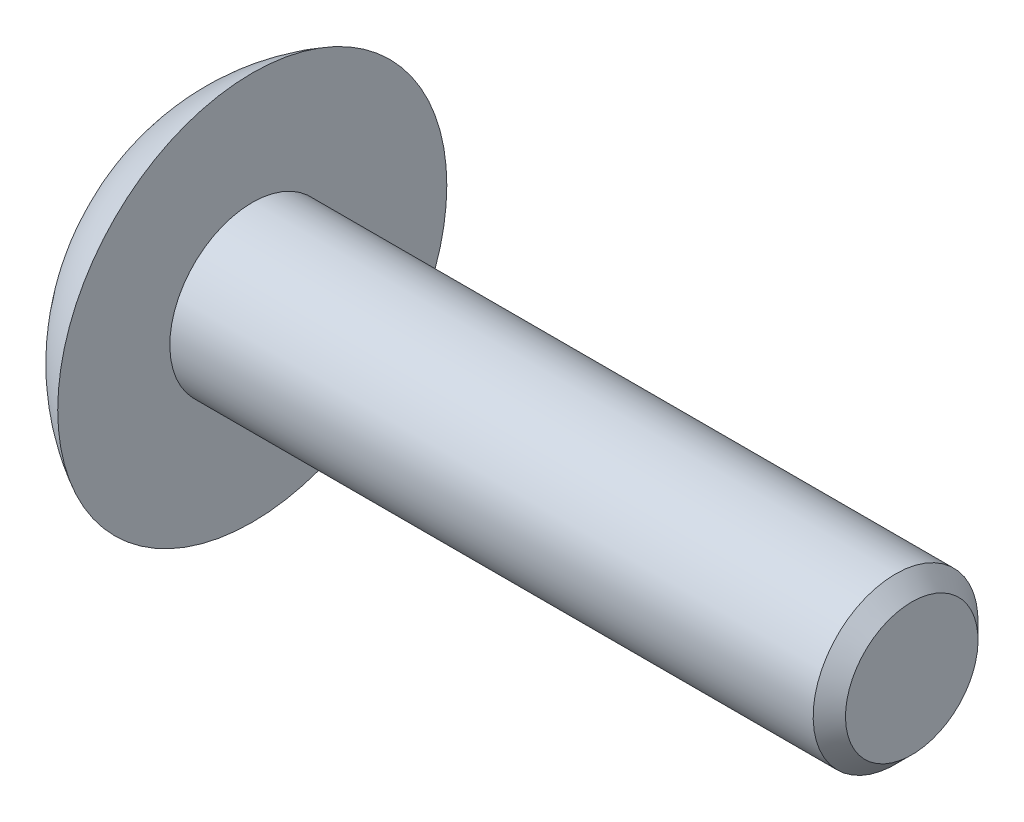
ISO-10303-21;
HEADER;
FILE_DESCRIPTION(('STEP AP214'),'2;1');
FILE_NAME('part.step','',(''),(''),'','','');
FILE_SCHEMA(('AUTOMOTIVE_DESIGN { 1 0 10303 214 1 1 1 1 }'));
ENDSEC;
DATA;
#1=APPLICATION_CONTEXT('core data for automotive mechanical design processes');
#2=APPLICATION_PROTOCOL_DEFINITION('international standard','automotive_design',2000,#1);
#3=PRODUCT_CONTEXT('',#1,'mechanical');
#4=PRODUCT('Part','Part','',(#3));
#5=PRODUCT_RELATED_PRODUCT_CATEGORY('part','',(#4));
#6=PRODUCT_DEFINITION_FORMATION('','',#4);
#7=PRODUCT_DEFINITION_CONTEXT('part definition',#1,'design');
#8=PRODUCT_DEFINITION('design','',#6,#7);
#9=PRODUCT_DEFINITION_SHAPE('','',#8);
#10=(LENGTH_UNIT() NAMED_UNIT(*) SI_UNIT(.MILLI.,.METRE.));
#11=(NAMED_UNIT(*) PLANE_ANGLE_UNIT() SI_UNIT($,.RADIAN.));
#12=(NAMED_UNIT(*) SI_UNIT($,.STERADIAN.) SOLID_ANGLE_UNIT());
#13=UNCERTAINTY_MEASURE_WITH_UNIT(LENGTH_MEASURE(1.E-05),#10,'distance_accuracy_value','');
#14=(GEOMETRIC_REPRESENTATION_CONTEXT(3) GLOBAL_UNCERTAINTY_ASSIGNED_CONTEXT((#13)) GLOBAL_UNIT_ASSIGNED_CONTEXT((#10,
#11,#12)) REPRESENTATION_CONTEXT('',''));
#15=CARTESIAN_POINT('',(0.,0.,0.));
#16=DIRECTION('',(0.,0.,1.));
#17=DIRECTION('',(1.,0.,0.));
#18=AXIS2_PLACEMENT_3D('',#15,#16,#17);
#19=CARTESIAN_POINT('',(0.,4.2,0.));
#20=DIRECTION('',(1.,0.,0.));
#21=DIRECTION('',(0.,1.,0.));
#22=AXIS2_PLACEMENT_3D('',#19,#20,#21);
#23=PLANE('',#22);
#24=CARTESIAN_POINT('',(0.,0.,0.));
#25=DIRECTION('',(-1.,0.,0.));
#26=DIRECTION('',(0.,0.,1.));
#27=AXIS2_PLACEMENT_3D('',#24,#25,#26);
#28=CIRCLE('',#27,5.90000000000001);
#29=CARTESIAN_POINT('',(0.,0.,5.90000000000001));
#30=VERTEX_POINT('',#29);
#31=EDGE_CURVE('E241',#30,#30,#28,.F.);
#32=ORIENTED_EDGE('',*,*,#31,.T.);
#33=EDGE_LOOP('',(#32));
#34=FACE_BOUND('',#33,.T.);
#35=CARTESIAN_POINT('',(0.,0.,0.));
#36=DIRECTION('',(1.,0.,0.));
#37=DIRECTION('',(0.,1.,0.));
#38=AXIS2_PLACEMENT_3D('',#35,#36,#37);
#39=CIRCLE('',#38,2.5);
#40=CARTESIAN_POINT('',(0.,2.5,0.));
#41=VERTEX_POINT('',#40);
#42=EDGE_CURVE('E198',#41,#41,#39,.T.);
#43=ORIENTED_EDGE('',*,*,#42,.F.);
#44=EDGE_LOOP('',(#43));
#45=FACE_BOUND('',#44,.T.);
#46=ADVANCED_FACE('F42',(#34,#45),#23,.T.);
#47=CARTESIAN_POINT('',(-1.55,0.,0.));
#48=DIRECTION('',(1.,0.,0.));
#49=DIRECTION('',(0.,0.,-1.));
#50=AXIS2_PLACEMENT_3D('',#47,#48,#49);
#51=PLANE('',#50);
#52=DIRECTION('',(0.,0.,1.));
#53=VECTOR('',#52,1.);
#54=CARTESIAN_POINT('',(-1.55,0.786666666666667,0.786666666666667));
#55=LINE('',#54,#53);
#56=CARTESIAN_POINT('',(-1.55,0.786666666666667,2.95));
#57=VERTEX_POINT('',#56);
#58=CARTESIAN_POINT('',(-1.55,0.786666666666667,0.786666666666667));
#59=VERTEX_POINT('',#58);
#60=EDGE_CURVE('E219',#57,#59,#55,.F.);
#61=ORIENTED_EDGE('',*,*,#60,.T.);
#62=DIRECTION('',(0.,-1.,0.));
#63=VECTOR('',#62,1.);
#64=CARTESIAN_POINT('',(-1.55,2.95,0.786666666666667));
#65=LINE('',#64,#63);
#66=CARTESIAN_POINT('',(-1.55,2.95,0.786666666666667));
#67=VERTEX_POINT('',#66);
#68=EDGE_CURVE('E226',#59,#67,#65,.F.);
#69=ORIENTED_EDGE('',*,*,#68,.T.);
#70=DIRECTION('',(0.,0.,1.));
#71=VECTOR('',#70,1.);
#72=CARTESIAN_POINT('',(-1.55,2.95,-0.786666666666667));
#73=LINE('',#72,#71);
#74=CARTESIAN_POINT('',(-1.55,2.95,-0.786666666666667));
#75=VERTEX_POINT('',#74);
#76=EDGE_CURVE('E231',#67,#75,#73,.F.);
#77=ORIENTED_EDGE('',*,*,#76,.T.);
#78=DIRECTION('',(0.,1.,0.));
#79=VECTOR('',#78,1.);
#80=CARTESIAN_POINT('',(-1.55,0.786666666666667,-0.786666666666667));
#81=LINE('',#80,#79);
#82=CARTESIAN_POINT('',(-1.55,0.786666666666667,-0.786666666666667));
#83=VERTEX_POINT('',#82);
#84=EDGE_CURVE('E235',#75,#83,#81,.F.);
#85=ORIENTED_EDGE('',*,*,#84,.T.);
#86=DIRECTION('',(0.,0.,1.));
#87=VECTOR('',#86,1.);
#88=CARTESIAN_POINT('',(-1.55,0.786666666666667,-2.95));
#89=LINE('',#88,#87);
#90=CARTESIAN_POINT('',(-1.55,0.786666666666667,-2.95));
#91=VERTEX_POINT('',#90);
#92=EDGE_CURVE('E194',#83,#91,#89,.F.);
#93=ORIENTED_EDGE('',*,*,#92,.T.);
#94=DIRECTION('',(0.,1.,0.));
#95=VECTOR('',#94,1.);
#96=CARTESIAN_POINT('',(-1.55,0.,-2.95));
#97=LINE('',#96,#95);
#98=CARTESIAN_POINT('',(-1.55,-0.786666666666667,-2.95));
#99=VERTEX_POINT('',#98);
#100=EDGE_CURVE('E122',#99,#91,#97,.T.);
#101=ORIENTED_EDGE('',*,*,#100,.F.);
#102=DIRECTION('',(0.,0.,-1.));
#103=VECTOR('',#102,1.);
#104=CARTESIAN_POINT('',(-1.55,-0.786666666666667,-0.786666666666667));
#105=LINE('',#104,#103);
#106=CARTESIAN_POINT('',(-1.55,-0.786666666666667,-0.786666666666667));
#107=VERTEX_POINT('',#106);
#108=EDGE_CURVE('E164',#99,#107,#105,.F.);
#109=ORIENTED_EDGE('',*,*,#108,.T.);
#110=DIRECTION('',(0.,1.,0.));
#111=VECTOR('',#110,1.);
#112=CARTESIAN_POINT('',(-1.55,-2.95,-0.786666666666667));
#113=LINE('',#112,#111);
#114=CARTESIAN_POINT('',(-1.55,-2.95,-0.786666666666667));
#115=VERTEX_POINT('',#114);
#116=EDGE_CURVE('E167',#107,#115,#113,.F.);
#117=ORIENTED_EDGE('',*,*,#116,.T.);
#118=DIRECTION('',(0.,0.,-1.));
#119=VECTOR('',#118,1.);
#120=CARTESIAN_POINT('',(-1.55,-2.95,0.786666666666667));
#121=LINE('',#120,#119);
#122=CARTESIAN_POINT('',(-1.55,-2.95,0.786666666666667));
#123=VERTEX_POINT('',#122);
#124=EDGE_CURVE('E199',#115,#123,#121,.F.);
#125=ORIENTED_EDGE('',*,*,#124,.T.);
#126=DIRECTION('',(0.,1.,0.));
#127=VECTOR('',#126,1.);
#128=CARTESIAN_POINT('',(-1.55,-0.786666666666667,0.786666666666667));
#129=LINE('',#128,#127);
#130=CARTESIAN_POINT('',(-1.55,-0.786666666666667,0.786666666666667));
#131=VERTEX_POINT('',#130);
#132=EDGE_CURVE('E203',#123,#131,#129,.T.);
#133=ORIENTED_EDGE('',*,*,#132,.T.);
#134=DIRECTION('',(0.,0.,-1.));
#135=VECTOR('',#134,1.);
#136=CARTESIAN_POINT('',(-1.55,-0.786666666666667,2.95));
#137=LINE('',#136,#135);
#138=CARTESIAN_POINT('',(-1.55,-0.786666666666667,2.95));
#139=VERTEX_POINT('',#138);
#140=EDGE_CURVE('E210',#131,#139,#137,.F.);
#141=ORIENTED_EDGE('',*,*,#140,.T.);
#142=DIRECTION('',(0.,1.,0.));
#143=VECTOR('',#142,1.);
#144=CARTESIAN_POINT('',(-1.55,0.786666666666667,2.95));
#145=LINE('',#144,#143);
#146=EDGE_CURVE('E215',#139,#57,#145,.T.);
#147=ORIENTED_EDGE('',*,*,#146,.T.);
#148=EDGE_LOOP('',(#61,#69,#77,#85,#93,#101,#109,#117,#125,#133,#141,#147));
#149=FACE_BOUND('',#148,.T.);
#150=ADVANCED_FACE('F166',(#149),#51,.F.);
#151=CARTESIAN_POINT('',(-1.55,0.786666666666667,-2.95));
#152=DIRECTION('',(0.,1.,0.));
#153=DIRECTION('',(0.,0.,1.));
#154=AXIS2_PLACEMENT_3D('',#151,#152,#153);
#155=PLANE('',#154);
#156=DIRECTION('',(-1.,0.,0.));
#157=VECTOR('',#156,1.);
#158=CARTESIAN_POINT('',(-1.55,0.786666666666667,-2.95));
#159=LINE('',#158,#157);
#160=CARTESIAN_POINT('',(-2.62861828029983,0.786666666666667,-2.95));
#161=VERTEX_POINT('',#160);
#162=EDGE_CURVE('E191',#161,#91,#159,.F.);
#163=ORIENTED_EDGE('',*,*,#162,.T.);
#164=ORIENTED_EDGE('',*,*,#92,.F.);
#165=DIRECTION('',(-1.,0.,0.));
#166=VECTOR('',#165,1.);
#167=CARTESIAN_POINT('',(-1.55,0.786666666666667,-0.786666666666667));
#168=LINE('',#167,#166);
#169=CARTESIAN_POINT('',(-3.1,0.786666666666667,-0.786666666666667));
#170=VERTEX_POINT('',#169);
#171=EDGE_CURVE('E238',#83,#170,#168,.T.);
#172=ORIENTED_EDGE('',*,*,#171,.T.);
#173=DIRECTION('',(0.,0.,1.));
#174=VECTOR('',#173,1.);
#175=CARTESIAN_POINT('',(-3.1,0.786666666666667,0.));
#176=LINE('',#175,#174);
#177=CARTESIAN_POINT('',(-3.1,0.786666666666667,-0.879520071149943));
#178=VERTEX_POINT('',#177);
#179=EDGE_CURVE('E108',#178,#170,#176,.T.);
#180=ORIENTED_EDGE('',*,*,#179,.F.);
#181=CARTESIAN_POINT('',(-2.62861828029983,0.786666666666667,-2.95));
#182=CARTESIAN_POINT('',(-2.66718863558401,0.786666666666668,-2.85839609244898));
#183=CARTESIAN_POINT('',(-2.70345278796431,0.786666666666667,-2.76584692702951));
#184=CARTESIAN_POINT('',(-2.77132310561709,0.786666666666667,-2.57905575573505));
#185=CARTESIAN_POINT('',(-2.8029292643271,0.786666666666667,-2.4848137474753));
#186=CARTESIAN_POINT('',(-2.89020449576757,0.786666666666668,-2.20142903018009));
#187=CARTESIAN_POINT('',(-2.93897423839909,0.786666666666672,-2.01009360067395));
#188=CARTESIAN_POINT('',(-2.99424875757496,0.786666666666669,-1.73997703602745));
#189=CARTESIAN_POINT('',(-3.00853499743015,0.786666666666667,-1.66269075546281));
#190=CARTESIAN_POINT('',(-3.03423623270905,0.786666666666666,-1.50763327973484));
#191=CARTESIAN_POINT('',(-3.04565121726897,0.786666666666667,-1.4298620827379));
#192=CARTESIAN_POINT('',(-3.0657562601308,0.786666666666667,-1.27346167643795));
#193=CARTESIAN_POINT('',(-3.07442820580998,0.786666666666666,-1.19483017160063));
#194=CARTESIAN_POINT('',(-3.0891394603424,0.786666666666668,-1.03732841026908));
#195=CARTESIAN_POINT('',(-3.09517904365207,0.786666666666669,-0.958458179528811));
#196=CARTESIAN_POINT('',(-3.1,0.786666666666674,-0.879520071149909));
#197=B_SPLINE_CURVE_WITH_KNOTS('',3,(#181,#182,#183,#184,#185,#186,#187,#188,#189,#190,#191,
#192,#193,#194,#195,#196),.UNSPECIFIED.,.F.,.F.,(4,2,2,2,2,2,2,4),(0.,0.298100748957458,
0.596201917892988,1.18743430645999,1.42318788266372,1.65894235086097,1.89622252045929,
2.13347794473701),.UNSPECIFIED.);
#198=EDGE_CURVE('E275',#161,#178,#197,.T.);
#199=ORIENTED_EDGE('',*,*,#198,.F.);
#200=EDGE_LOOP('',(#163,#164,#172,#180,#199));
#201=FACE_BOUND('',#200,.T.);
#202=ADVANCED_FACE('F317',(#201),#155,.F.);
#203=CARTESIAN_POINT('',(-3.1,0.589999999999995,0.));
#204=DIRECTION('',(-1.,0.,0.));
#205=DIRECTION('',(0.,0.,1.));
#206=AXIS2_PLACEMENT_3D('',#203,#204,#205);
#207=PLANE('',#206);
#208=DIRECTION('',(0.,1.,0.));
#209=VECTOR('',#208,1.);
#210=CARTESIAN_POINT('',(-3.1,0.786666666666667,-0.786666666666667));
#211=LINE('',#210,#209);
#212=CARTESIAN_POINT('',(-3.1,0.879520071149943,-0.786666666666667));
#213=VERTEX_POINT('',#212);
#214=EDGE_CURVE('E234',#170,#213,#211,.T.);
#215=ORIENTED_EDGE('',*,*,#214,.T.);
#216=CARTESIAN_POINT('',(-3.1,0.,0.));
#217=DIRECTION('',(-1.,0.,0.));
#218=DIRECTION('',(0.,0.,1.));
#219=AXIS2_PLACEMENT_3D('',#216,#217,#218);
#220=CIRCLE('',#219,1.18000000000005);
#221=EDGE_CURVE('E445',#178,#213,#220,.F.);
#222=ORIENTED_EDGE('',*,*,#221,.F.);
#223=ORIENTED_EDGE('',*,*,#179,.T.);
#224=EDGE_LOOP('',(#215,#222,#223));
#225=FACE_BOUND('',#224,.T.);
#226=ADVANCED_FACE('F435',(#225),#207,.T.);
#227=CARTESIAN_POINT('',(-1.55,0.786666666666667,-0.786666666666667));
#228=DIRECTION('',(0.,0.,-1.));
#229=DIRECTION('',(-1.,0.,0.));
#230=AXIS2_PLACEMENT_3D('',#227,#228,#229);
#231=PLANE('',#230);
#232=ORIENTED_EDGE('',*,*,#171,.F.);
#233=ORIENTED_EDGE('',*,*,#84,.F.);
#234=DIRECTION('',(1.,0.,0.));
#235=VECTOR('',#234,1.);
#236=CARTESIAN_POINT('',(-1.55,2.95,-0.786666666666667));
#237=LINE('',#236,#235);
#238=CARTESIAN_POINT('',(-2.62861828029983,2.95,-0.786666666666668));
#239=VERTEX_POINT('',#238);
#240=EDGE_CURVE('E230',#75,#239,#237,.F.);
#241=ORIENTED_EDGE('',*,*,#240,.T.);
#242=CARTESIAN_POINT('',(-3.1,0.879520071149905,-0.786666666666668));
#243=CARTESIAN_POINT('',(-3.09397288713097,0.978548970101501,-0.786666666666667));
#244=CARTESIAN_POINT('',(-3.08599754520284,1.07747542603251,-0.786666666666667));
#245=CARTESIAN_POINT('',(-3.06582531723018,1.27492348903208,-0.786666666666667));
#246=CARTESIAN_POINT('',(-3.05362720860149,1.37344497048358,-0.786666666666667));
#247=CARTESIAN_POINT('',(-3.02480539923135,1.56902528685858,-0.786666666666667));
#248=CARTESIAN_POINT('',(-3.00821857395913,1.66608949841144,-0.786666666666667));
#249=CARTESIAN_POINT('',(-2.97047352859742,1.85930679627951,-0.786666666666667));
#250=CARTESIAN_POINT('',(-2.9493159491858,1.95546000831886,-0.786666666666667));
#251=CARTESIAN_POINT('',(-2.88829311333329,2.20394474702879,-0.786666666666667));
#252=CARTESIAN_POINT('',(-2.84481570326371,2.35540603428801,-0.786666666666667));
#253=CARTESIAN_POINT('',(-2.74578312914681,2.65542498087281,-0.786666666666667));
#254=CARTESIAN_POINT('',(-2.69015075933113,2.80395713960298,-0.786666666666667));
#255=CARTESIAN_POINT('',(-2.62861828029983,2.95,-0.786666666666665));
#256=B_SPLINE_CURVE_WITH_KNOTS('',3,(#242,#243,#244,#245,#246,#247,#248,#249,#250,#251,#252,
#253,#254,#255),.UNSPECIFIED.,.F.,.F.,(4,2,2,2,2,2,4),(0.,0.297641330244974,0.595368906394795,
0.890670217534754,1.18593016342102,1.65815673075408,2.13347481337182),.UNSPECIFIED.);
#257=EDGE_CURVE('E438',#213,#239,#256,.T.);
#258=ORIENTED_EDGE('',*,*,#257,.F.);
#259=ORIENTED_EDGE('',*,*,#214,.F.);
#260=EDGE_LOOP('',(#232,#233,#241,#258,#259));
#261=FACE_BOUND('',#260,.T.);
#262=ADVANCED_FACE('F430',(#261),#231,.F.);
#263=CARTESIAN_POINT('',(-1.55,2.95,-0.786666666666667));
#264=DIRECTION('',(0.,1.,0.));
#265=DIRECTION('',(0.,0.,1.));
#266=AXIS2_PLACEMENT_3D('',#263,#264,#265);
#267=PLANE('',#266);
#268=ORIENTED_EDGE('',*,*,#240,.F.);
#269=ORIENTED_EDGE('',*,*,#76,.F.);
#270=DIRECTION('',(1.,0.,0.));
#271=VECTOR('',#270,1.);
#272=CARTESIAN_POINT('',(-1.55,2.95,0.786666666666667));
#273=LINE('',#272,#271);
#274=CARTESIAN_POINT('',(-2.62861828029983,2.95,0.786666666666667));
#275=VERTEX_POINT('',#274);
#276=EDGE_CURVE('E229',#67,#275,#273,.F.);
#277=ORIENTED_EDGE('',*,*,#276,.T.);
#278=CARTESIAN_POINT('',(-2.62861828029983,2.95,-0.786666666666667));
#279=CARTESIAN_POINT('',(-2.63966407837396,2.95,-0.688249341797939));
#280=CARTESIAN_POINT('',(-2.64859592115799,2.95,-0.589616017706215));
#281=CARTESIAN_POINT('',(-2.66228625116627,2.95,-0.392046513584564));
#282=CARTESIAN_POINT('',(-2.66704418232396,2.95,-0.293110294963068));
#283=CARTESIAN_POINT('',(-2.67510884660039,2.95,0.00294457334009367));
#284=CARTESIAN_POINT('',(-2.67231397791532,2.95000000000001,0.20028145465386));
#285=CARTESIAN_POINT('',(-2.65767270339962,2.95,0.462100448422134));
#286=CARTESIAN_POINT('',(-2.65314026764951,2.95,0.527063926287914));
#287=CARTESIAN_POINT('',(-2.64225327692346,2.95,0.656938474742147));
#288=CARTESIAN_POINT('',(-2.63589593156154,2.95,0.721849311243748));
#289=CARTESIAN_POINT('',(-2.62861828029983,2.95,0.786666666666667));
#290=B_SPLINE_CURVE_WITH_KNOTS('',3,(#278,#279,#280,#281,#282,#283,#284,#285,#286,#287,#288,
#289),.UNSPECIFIED.,.F.,.F.,(4,2,2,2,2,4),(0.,0.297042304224057,0.594124175701435,
1.18536266016633,1.38071054223493,1.57635872758455),.UNSPECIFIED.);
#291=EDGE_CURVE('E416',#239,#275,#290,.T.);
#292=ORIENTED_EDGE('',*,*,#291,.F.);
#293=EDGE_LOOP('',(#268,#269,#277,#292));
#294=FACE_BOUND('',#293,.T.);
#295=ADVANCED_FACE('F425',(#294),#267,.F.);
#296=CARTESIAN_POINT('',(-1.55,2.95,0.786666666666667));
#297=DIRECTION('',(0.,0.,1.));
#298=DIRECTION('',(0.,-1.,0.));
#299=AXIS2_PLACEMENT_3D('',#296,#297,#298);
#300=PLANE('',#299);
#301=ORIENTED_EDGE('',*,*,#276,.F.);
#302=ORIENTED_EDGE('',*,*,#68,.F.);
#303=DIRECTION('',(1.,0.,0.));
#304=VECTOR('',#303,1.);
#305=CARTESIAN_POINT('',(-1.55,0.786666666666667,0.786666666666667));
#306=LINE('',#305,#304);
#307=CARTESIAN_POINT('',(-3.1,0.786666666666667,0.786666666666667));
#308=VERTEX_POINT('',#307);
#309=EDGE_CURVE('E222',#59,#308,#306,.F.);
#310=ORIENTED_EDGE('',*,*,#309,.T.);
#311=DIRECTION('',(0.,1.,0.));
#312=VECTOR('',#311,1.);
#313=CARTESIAN_POINT('',(-3.1,0.589999999999995,0.786666666666667));
#314=LINE('',#313,#312);
#315=CARTESIAN_POINT('',(-3.1,0.879520071149944,0.786666666666667));
#316=VERTEX_POINT('',#315);
#317=EDGE_CURVE('E223',#316,#308,#314,.F.);
#318=ORIENTED_EDGE('',*,*,#317,.F.);
#319=CARTESIAN_POINT('',(-2.62861828029983,2.95,0.786666666666667));
#320=CARTESIAN_POINT('',(-2.66718863558401,2.85839609244898,0.786666666666667));
#321=CARTESIAN_POINT('',(-2.70345278796431,2.76584692702951,0.786666666666667));
#322=CARTESIAN_POINT('',(-2.77132310561709,2.57905575573505,0.786666666666667));
#323=CARTESIAN_POINT('',(-2.8029292643271,2.4848137474753,0.786666666666667));
#324=CARTESIAN_POINT('',(-2.89020449576757,2.20142903018009,0.786666666666667));
#325=CARTESIAN_POINT('',(-2.93897423839909,2.01009360067395,0.786666666666669));
#326=CARTESIAN_POINT('',(-2.99424875757496,1.73997703602745,0.786666666666668));
#327=CARTESIAN_POINT('',(-3.00853499743015,1.66269075546281,0.786666666666667));
#328=CARTESIAN_POINT('',(-3.03423623270905,1.50763327973484,0.786666666666666));
#329=CARTESIAN_POINT('',(-3.04565121726897,1.4298620827379,0.786666666666667));
#330=CARTESIAN_POINT('',(-3.0657562601308,1.27346167643795,0.786666666666667));
#331=CARTESIAN_POINT('',(-3.07442820580998,1.19483017160063,0.786666666666667));
#332=CARTESIAN_POINT('',(-3.0891394603424,1.03732841026908,0.786666666666667));
#333=CARTESIAN_POINT('',(-3.09517904365207,0.958458179528807,0.786666666666667));
#334=CARTESIAN_POINT('',(-3.1,0.879520071149906,0.786666666666667));
#335=B_SPLINE_CURVE_WITH_KNOTS('',3,(#319,#320,#321,#322,#323,#324,#325,#326,#327,#328,#329,
#330,#331,#332,#333,#334),.UNSPECIFIED.,.F.,.F.,(4,2,2,2,2,2,2,4),(0.,0.298100748957458,
0.596201917892988,1.18743430645999,1.42318788266372,1.65894235086097,1.89622252045929,
2.13347794473701),.UNSPECIFIED.);
#336=EDGE_CURVE('E409',#275,#316,#335,.T.);
#337=ORIENTED_EDGE('',*,*,#336,.F.);
#338=EDGE_LOOP('',(#301,#302,#310,#318,#337));
#339=FACE_BOUND('',#338,.T.);
#340=ADVANCED_FACE('F422',(#339),#300,.F.);
#341=CARTESIAN_POINT('',(-3.1,0.589999999999995,0.));
#342=DIRECTION('',(-1.,0.,0.));
#343=DIRECTION('',(0.,0.,1.));
#344=AXIS2_PLACEMENT_3D('',#341,#342,#343);
#345=PLANE('',#344);
#346=DIRECTION('',(0.,0.,1.));
#347=VECTOR('',#346,1.);
#348=CARTESIAN_POINT('',(-3.1,0.786666666666667,0.786666666666667));
#349=LINE('',#348,#347);
#350=CARTESIAN_POINT('',(-3.1,0.786666666666667,0.879520071149943));
#351=VERTEX_POINT('',#350);
#352=EDGE_CURVE('E218',#308,#351,#349,.T.);
#353=ORIENTED_EDGE('',*,*,#352,.T.);
#354=CARTESIAN_POINT('',(-3.1,0.,0.));
#355=DIRECTION('',(-1.,0.,0.));
#356=DIRECTION('',(0.,0.,1.));
#357=AXIS2_PLACEMENT_3D('',#354,#355,#356);
#358=CIRCLE('',#357,1.18000000000005);
#359=EDGE_CURVE('E405',#316,#351,#358,.F.);
#360=ORIENTED_EDGE('',*,*,#359,.F.);
#361=ORIENTED_EDGE('',*,*,#317,.T.);
#362=EDGE_LOOP('',(#353,#360,#361));
#363=FACE_BOUND('',#362,.T.);
#364=ADVANCED_FACE('F396',(#363),#345,.T.);
#365=CARTESIAN_POINT('',(-1.55,0.786666666666667,0.786666666666667));
#366=DIRECTION('',(0.,1.,0.));
#367=DIRECTION('',(0.,0.,1.));
#368=AXIS2_PLACEMENT_3D('',#365,#366,#367);
#369=PLANE('',#368);
#370=ORIENTED_EDGE('',*,*,#309,.F.);
#371=ORIENTED_EDGE('',*,*,#60,.F.);
#372=DIRECTION('',(1.,0.,0.));
#373=VECTOR('',#372,1.);
#374=CARTESIAN_POINT('',(-1.55,0.786666666666667,2.95));
#375=LINE('',#374,#373);
#376=CARTESIAN_POINT('',(-2.62861828029983,0.786666666666667,2.95));
#377=VERTEX_POINT('',#376);
#378=EDGE_CURVE('E214',#57,#377,#375,.F.);
#379=ORIENTED_EDGE('',*,*,#378,.T.);
#380=CARTESIAN_POINT('',(-3.1,0.786666666666668,0.879520071149905));
#381=CARTESIAN_POINT('',(-3.09397288713097,0.786666666666667,0.978548970101502));
#382=CARTESIAN_POINT('',(-3.08599754520284,0.786666666666667,1.07747542603251));
#383=CARTESIAN_POINT('',(-3.06582531723019,0.786666666666667,1.27492348903208));
#384=CARTESIAN_POINT('',(-3.05362720860149,0.786666666666667,1.37344497048359));
#385=CARTESIAN_POINT('',(-3.02480539923135,0.786666666666667,1.56902528685858));
#386=CARTESIAN_POINT('',(-3.00821857395913,0.786666666666667,1.66608949841144));
#387=CARTESIAN_POINT('',(-2.97047352859742,0.786666666666667,1.85930679627952));
#388=CARTESIAN_POINT('',(-2.94931594918579,0.786666666666669,1.95546000831887));
#389=CARTESIAN_POINT('',(-2.88829311333329,0.78666666666667,2.20394474702879));
#390=CARTESIAN_POINT('',(-2.84481570326371,0.786666666666668,2.35540603428802));
#391=CARTESIAN_POINT('',(-2.74578312914681,0.786666666666666,2.65542498087281));
#392=CARTESIAN_POINT('',(-2.69015075933113,0.786666666666665,2.80395713960298));
#393=CARTESIAN_POINT('',(-2.62861828029983,0.786666666666667,2.95));
#394=B_SPLINE_CURVE_WITH_KNOTS('',3,(#380,#381,#382,#383,#384,#385,#386,#387,#388,#389,#390,
#391,#392,#393),.UNSPECIFIED.,.F.,.F.,(4,2,2,2,2,2,4),(0.,0.297641330244975,0.595368906394798,
0.890670217534758,1.18593016342103,1.65815673075408,2.13347481337183),.UNSPECIFIED.);
#395=EDGE_CURVE('E399',#351,#377,#394,.T.);
#396=ORIENTED_EDGE('',*,*,#395,.F.);
#397=ORIENTED_EDGE('',*,*,#352,.F.);
#398=EDGE_LOOP('',(#370,#371,#379,#396,#397));
#399=FACE_BOUND('',#398,.T.);
#400=ADVANCED_FACE('F391',(#399),#369,.F.);
#401=CARTESIAN_POINT('',(-1.55,0.786666666666667,2.95));
#402=DIRECTION('',(0.,0.,1.));
#403=DIRECTION('',(1.,0.,0.));
#404=AXIS2_PLACEMENT_3D('',#401,#402,#403);
#405=PLANE('',#404);
#406=ORIENTED_EDGE('',*,*,#378,.F.);
#407=ORIENTED_EDGE('',*,*,#146,.F.);
#408=DIRECTION('',(1.,0.,0.));
#409=VECTOR('',#408,1.);
#410=CARTESIAN_POINT('',(-1.55,-0.786666666666667,2.95));
#411=LINE('',#410,#409);
#412=CARTESIAN_POINT('',(-2.62861828029983,-0.786666666666667,2.95));
#413=VERTEX_POINT('',#412);
#414=EDGE_CURVE('E213',#139,#413,#411,.F.);
#415=ORIENTED_EDGE('',*,*,#414,.T.);
#416=CARTESIAN_POINT('',(-2.62861828029983,0.786666666666668,2.95));
#417=CARTESIAN_POINT('',(-2.64328483285758,0.655897258107646,2.95));
#418=CARTESIAN_POINT('',(-2.65423701779566,0.524719362616082,2.95));
#419=CARTESIAN_POINT('',(-2.66877452719718,0.262360142376295,2.95));
#420=CARTESIAN_POINT('',(-2.67238242502518,0.131180071188147,2.95));
#421=CARTESIAN_POINT('',(-2.67238242502518,-0.131180071188147,2.95));
#422=CARTESIAN_POINT('',(-2.66877452719718,-0.262360142376294,2.95));
#423=CARTESIAN_POINT('',(-2.65423701779566,-0.52471936261608,2.95));
#424=CARTESIAN_POINT('',(-2.64328483285758,-0.655897258107644,2.95));
#425=CARTESIAN_POINT('',(-2.62861828029983,-0.786666666666665,2.95000000000001));
#426=B_SPLINE_CURVE_WITH_KNOTS('',3,(#416,#417,#418,#419,#420,#421,#422,#423,#424,#425),
.UNSPECIFIED.,.F.,.F.,(4,2,2,2,4),(0.,0.394702580849597,0.788190162797951,1.1816777447463,
1.5763803255959),.UNSPECIFIED.);
#427=EDGE_CURVE('E377',#377,#413,#426,.T.);
#428=ORIENTED_EDGE('',*,*,#427,.F.);
#429=EDGE_LOOP('',(#406,#407,#415,#428));
#430=FACE_BOUND('',#429,.T.);
#431=ADVANCED_FACE('F386',(#430),#405,.F.);
#432=CARTESIAN_POINT('',(-1.55,-0.786666666666667,2.95));
#433=DIRECTION('',(0.,-1.,0.));
#434=DIRECTION('',(0.,0.,-1.));
#435=AXIS2_PLACEMENT_3D('',#432,#433,#434);
#436=PLANE('',#435);
#437=CARTESIAN_POINT('',(-2.62861828029983,-0.786666666666668,2.95));
#438=CARTESIAN_POINT('',(-2.66718863558401,-0.786666666666668,2.85839609244898));
#439=CARTESIAN_POINT('',(-2.70345278796431,-0.786666666666667,2.76584692702951));
#440=CARTESIAN_POINT('',(-2.77132310561709,-0.786666666666667,2.57905575573505));
#441=CARTESIAN_POINT('',(-2.8029292643271,-0.786666666666666,2.4848137474753));
#442=CARTESIAN_POINT('',(-2.89020449576757,-0.786666666666668,2.20142903018009));
#443=CARTESIAN_POINT('',(-2.93897423839909,-0.786666666666672,2.01009360067395));
#444=CARTESIAN_POINT('',(-2.99424875757496,-0.786666666666669,1.73997703602745));
#445=CARTESIAN_POINT('',(-3.00853499743015,-0.786666666666668,1.66269075546281));
#446=CARTESIAN_POINT('',(-3.03423623270905,-0.786666666666666,1.50763327973484));
#447=CARTESIAN_POINT('',(-3.04565121726897,-0.786666666666667,1.4298620827379));
#448=CARTESIAN_POINT('',(-3.0657562601308,-0.786666666666667,1.27346167643795));
#449=CARTESIAN_POINT('',(-3.07442820580998,-0.786666666666666,1.19483017160063));
#450=CARTESIAN_POINT('',(-3.0891394603424,-0.786666666666668,1.03732841026908));
#451=CARTESIAN_POINT('',(-3.09517904365207,-0.78666666666667,0.95845817952881));
#452=CARTESIAN_POINT('',(-3.1,-0.786666666666675,0.879520071149909));
#453=B_SPLINE_CURVE_WITH_KNOTS('',3,(#437,#438,#439,#440,#441,#442,#443,#444,#445,#446,#447,
#448,#449,#450,#451,#452),.UNSPECIFIED.,.F.,.F.,(4,2,2,2,2,2,2,4),(0.,0.298100748957458,
0.596201917892988,1.18743430645999,1.42318788266372,1.65894235086097,1.89622252045929,
2.13347794473701),.UNSPECIFIED.);
#454=CARTESIAN_POINT('',(-3.1,-0.786666666666667,0.879520071149944));
#455=VERTEX_POINT('',#454);
#456=EDGE_CURVE('E370',#413,#455,#453,.T.);
#457=ORIENTED_EDGE('',*,*,#456,.F.);
#458=ORIENTED_EDGE('',*,*,#414,.F.);
#459=ORIENTED_EDGE('',*,*,#140,.F.);
#460=DIRECTION('',(1.,0.,0.));
#461=VECTOR('',#460,1.);
#462=CARTESIAN_POINT('',(-1.55,-0.786666666666667,0.786666666666667));
#463=LINE('',#462,#461);
#464=CARTESIAN_POINT('',(-3.1,-0.786666666666667,0.786666666666667));
#465=VERTEX_POINT('',#464);
#466=EDGE_CURVE('E206',#131,#465,#463,.F.);
#467=ORIENTED_EDGE('',*,*,#466,.T.);
#468=DIRECTION('',(0.,0.,1.));
#469=VECTOR('',#468,1.);
#470=CARTESIAN_POINT('',(-3.1,-0.786666666666667,0.));
#471=LINE('',#470,#469);
#472=EDGE_CURVE('E207',#455,#465,#471,.F.);
#473=ORIENTED_EDGE('',*,*,#472,.F.);
#474=EDGE_LOOP('',(#457,#458,#459,#467,#473));
#475=FACE_BOUND('',#474,.T.);
#476=ADVANCED_FACE('F383',(#475),#436,.F.);
#477=CARTESIAN_POINT('',(-3.1,0.589999999999995,0.));
#478=DIRECTION('',(-1.,0.,0.));
#479=DIRECTION('',(0.,0.,1.));
#480=AXIS2_PLACEMENT_3D('',#477,#478,#479);
#481=PLANE('',#480);
#482=CARTESIAN_POINT('',(-3.1,0.,0.));
#483=DIRECTION('',(-1.,0.,0.));
#484=DIRECTION('',(0.,0.,1.));
#485=AXIS2_PLACEMENT_3D('',#482,#483,#484);
#486=CIRCLE('',#485,1.18000000000005);
#487=CARTESIAN_POINT('',(-3.1,-0.879520071149944,0.786666666666667));
#488=VERTEX_POINT('',#487);
#489=EDGE_CURVE('E366',#455,#488,#486,.F.);
#490=ORIENTED_EDGE('',*,*,#489,.F.);
#491=ORIENTED_EDGE('',*,*,#472,.T.);
#492=DIRECTION('',(0.,1.,0.));
#493=VECTOR('',#492,1.);
#494=CARTESIAN_POINT('',(-3.1,-0.786666666666667,0.786666666666667));
#495=LINE('',#494,#493);
#496=EDGE_CURVE('E202',#465,#488,#495,.F.);
#497=ORIENTED_EDGE('',*,*,#496,.T.);
#498=EDGE_LOOP('',(#490,#491,#497));
#499=FACE_BOUND('',#498,.T.);
#500=ADVANCED_FACE('F356',(#499),#481,.T.);
#501=CARTESIAN_POINT('',(-1.55,-0.786666666666667,0.786666666666667));
#502=DIRECTION('',(0.,0.,1.));
#503=DIRECTION('',(1.,0.,0.));
#504=AXIS2_PLACEMENT_3D('',#501,#502,#503);
#505=PLANE('',#504);
#506=ORIENTED_EDGE('',*,*,#496,.F.);
#507=ORIENTED_EDGE('',*,*,#466,.F.);
#508=ORIENTED_EDGE('',*,*,#132,.F.);
#509=DIRECTION('',(1.,0.,0.));
#510=VECTOR('',#509,1.);
#511=CARTESIAN_POINT('',(-1.55,-2.95,0.786666666666667));
#512=LINE('',#511,#510);
#513=CARTESIAN_POINT('',(-2.62861828029983,-2.95,0.786666666666667));
#514=VERTEX_POINT('',#513);
#515=EDGE_CURVE('E181',#123,#514,#512,.F.);
#516=ORIENTED_EDGE('',*,*,#515,.T.);
#517=CARTESIAN_POINT('',(-3.1,-0.879520071149905,0.786666666666667));
#518=CARTESIAN_POINT('',(-3.09397288713097,-0.978548970101502,0.786666666666667));
#519=CARTESIAN_POINT('',(-3.08599754520284,-1.07747542603251,0.786666666666667));
#520=CARTESIAN_POINT('',(-3.06582531723019,-1.27492348903208,0.786666666666667));
#521=CARTESIAN_POINT('',(-3.05362720860149,-1.37344497048358,0.786666666666667));
#522=CARTESIAN_POINT('',(-3.02480539923135,-1.56902528685858,0.786666666666667));
#523=CARTESIAN_POINT('',(-3.00821857395913,-1.66608949841144,0.786666666666668));
#524=CARTESIAN_POINT('',(-2.97047352859742,-1.85930679627952,0.786666666666666));
#525=CARTESIAN_POINT('',(-2.9493159491858,-1.95546000831886,0.786666666666665));
#526=CARTESIAN_POINT('',(-2.88829311333329,-2.20394474702879,0.786666666666664));
#527=CARTESIAN_POINT('',(-2.84481570326371,-2.35540603428801,0.786666666666666));
#528=CARTESIAN_POINT('',(-2.74578312914681,-2.65542498087281,0.786666666666668));
#529=CARTESIAN_POINT('',(-2.69015075933113,-2.80395713960298,0.786666666666669));
#530=CARTESIAN_POINT('',(-2.62861828029983,-2.95,0.786666666666666));
#531=B_SPLINE_CURVE_WITH_KNOTS('',3,(#517,#518,#519,#520,#521,#522,#523,#524,#525,#526,#527,
#528,#529,#530),.UNSPECIFIED.,.F.,.F.,(4,2,2,2,2,2,4),(0.,0.297641330244974,0.595368906394795,
0.890670217534754,1.18593016342102,1.65815673075408,2.13347481337183),.UNSPECIFIED.);
#532=EDGE_CURVE('E359',#488,#514,#531,.T.);
#533=ORIENTED_EDGE('',*,*,#532,.F.);
#534=EDGE_LOOP('',(#506,#507,#508,#516,#533));
#535=FACE_BOUND('',#534,.T.);
#536=ADVANCED_FACE('F351',(#535),#505,.F.);
#537=CARTESIAN_POINT('',(-1.55,-2.95,0.786666666666667));
#538=DIRECTION('',(0.,-1.,0.));
#539=DIRECTION('',(0.,0.,-1.));
#540=AXIS2_PLACEMENT_3D('',#537,#538,#539);
#541=PLANE('',#540);
#542=ORIENTED_EDGE('',*,*,#515,.F.);
#543=ORIENTED_EDGE('',*,*,#124,.F.);
#544=DIRECTION('',(1.,0.,0.));
#545=VECTOR('',#544,1.);
#546=CARTESIAN_POINT('',(-1.55,-2.95,-0.786666666666667));
#547=LINE('',#546,#545);
#548=CARTESIAN_POINT('',(-2.62861828029983,-2.95,-0.786666666666667));
#549=VERTEX_POINT('',#548);
#550=EDGE_CURVE('E179',#115,#549,#547,.F.);
#551=ORIENTED_EDGE('',*,*,#550,.T.);
#552=CARTESIAN_POINT('',(-2.62861828029983,-2.95,0.786666666666666));
#553=CARTESIAN_POINT('',(-2.63966407837396,-2.95,0.688249341797938));
#554=CARTESIAN_POINT('',(-2.64859592115799,-2.95,0.589616017706214));
#555=CARTESIAN_POINT('',(-2.66228625116627,-2.95,0.392046513584564));
#556=CARTESIAN_POINT('',(-2.66704418232396,-2.95,0.293110294963068));
#557=CARTESIAN_POINT('',(-2.67510884660039,-2.95,-0.00294457334009375));
#558=CARTESIAN_POINT('',(-2.67231397791532,-2.95000000000001,-0.20028145465386));
#559=CARTESIAN_POINT('',(-2.65767270339962,-2.95,-0.462100448422134));
#560=CARTESIAN_POINT('',(-2.65314026764951,-2.95,-0.527063926287914));
#561=CARTESIAN_POINT('',(-2.64225327692346,-2.95,-0.656938474742147));
#562=CARTESIAN_POINT('',(-2.63589593156154,-2.95,-0.721849311243748));
#563=CARTESIAN_POINT('',(-2.62861828029983,-2.95,-0.786666666666666));
#564=B_SPLINE_CURVE_WITH_KNOTS('',3,(#552,#553,#554,#555,#556,#557,#558,#559,#560,#561,#562,
#563),.UNSPECIFIED.,.F.,.F.,(4,2,2,2,2,4),(0.,0.297042304224057,0.594124175701435,
1.18536266016633,1.38071054223493,1.57635872758455),.UNSPECIFIED.);
#565=EDGE_CURVE('E332',#514,#549,#564,.T.);
#566=ORIENTED_EDGE('',*,*,#565,.F.);
#567=EDGE_LOOP('',(#542,#543,#551,#566));
#568=FACE_BOUND('',#567,.T.);
#569=ADVANCED_FACE('F347',(#568),#541,.F.);
#570=CARTESIAN_POINT('',(-1.55,-2.95,-0.786666666666667));
#571=DIRECTION('',(0.,0.,-1.));
#572=DIRECTION('',(0.,1.,0.));
#573=AXIS2_PLACEMENT_3D('',#570,#571,#572);
#574=PLANE('',#573);
#575=CARTESIAN_POINT('',(-2.62861828029983,-2.95,-0.786666666666668));
#576=CARTESIAN_POINT('',(-2.66718863558401,-2.85839609244898,-0.786666666666668));
#577=CARTESIAN_POINT('',(-2.70345278796431,-2.76584692702951,-0.786666666666667));
#578=CARTESIAN_POINT('',(-2.77132310561709,-2.57905575573505,-0.786666666666667));
#579=CARTESIAN_POINT('',(-2.8029292643271,-2.4848137474753,-0.786666666666667));
#580=CARTESIAN_POINT('',(-2.89020449576757,-2.20142903018009,-0.786666666666668));
#581=CARTESIAN_POINT('',(-2.93897423839909,-2.01009360067395,-0.78666666666667));
#582=CARTESIAN_POINT('',(-2.99424875757496,-1.73997703602745,-0.786666666666669));
#583=CARTESIAN_POINT('',(-3.00853499743015,-1.66269075546281,-0.786666666666668));
#584=CARTESIAN_POINT('',(-3.03423623270905,-1.50763327973484,-0.786666666666667));
#585=CARTESIAN_POINT('',(-3.04565121726897,-1.42986208273789,-0.786666666666667));
#586=CARTESIAN_POINT('',(-3.0657562601308,-1.27346167643795,-0.786666666666667));
#587=CARTESIAN_POINT('',(-3.07442820580998,-1.19483017160063,-0.786666666666667));
#588=CARTESIAN_POINT('',(-3.0891394603424,-1.03732841026908,-0.786666666666667));
#589=CARTESIAN_POINT('',(-3.09517904365207,-0.958458179528806,-0.786666666666668));
#590=CARTESIAN_POINT('',(-3.1,-0.879520071149905,-0.786666666666668));
#591=B_SPLINE_CURVE_WITH_KNOTS('',3,(#575,#576,#577,#578,#579,#580,#581,#582,#583,#584,#585,
#586,#587,#588,#589,#590),.UNSPECIFIED.,.F.,.F.,(4,2,2,2,2,2,2,4),(0.,0.298100748957458,
0.596201917892988,1.18743430645999,1.42318788266372,1.65894235086097,1.89622252045929,
2.13347794473701),.UNSPECIFIED.);
#592=CARTESIAN_POINT('',(-3.1,-0.879520071149943,-0.786666666666667));
#593=VERTEX_POINT('',#592);
#594=EDGE_CURVE('E328',#549,#593,#591,.T.);
#595=ORIENTED_EDGE('',*,*,#594,.F.);
#596=ORIENTED_EDGE('',*,*,#550,.F.);
#597=ORIENTED_EDGE('',*,*,#116,.F.);
#598=DIRECTION('',(1.,0.,0.));
#599=VECTOR('',#598,1.);
#600=CARTESIAN_POINT('',(-1.55,-0.786666666666667,-0.786666666666667));
#601=LINE('',#600,#599);
#602=CARTESIAN_POINT('',(-3.1,-0.786666666666667,-0.786666666666667));
#603=VERTEX_POINT('',#602);
#604=EDGE_CURVE('E171',#107,#603,#601,.F.);
#605=ORIENTED_EDGE('',*,*,#604,.T.);
#606=DIRECTION('',(0.,1.,0.));
#607=VECTOR('',#606,1.);
#608=CARTESIAN_POINT('',(-3.1,0.589999999999995,-0.786666666666667));
#609=LINE('',#608,#607);
#610=EDGE_CURVE('E172',#593,#603,#609,.T.);
#611=ORIENTED_EDGE('',*,*,#610,.F.);
#612=EDGE_LOOP('',(#595,#596,#597,#605,#611));
#613=FACE_BOUND('',#612,.T.);
#614=ADVANCED_FACE('F177',(#613),#574,.F.);
#615=CARTESIAN_POINT('',(-3.1,0.589999999999995,0.));
#616=DIRECTION('',(-1.,0.,0.));
#617=DIRECTION('',(0.,0.,1.));
#618=AXIS2_PLACEMENT_3D('',#615,#616,#617);
#619=PLANE('',#618);
#620=CARTESIAN_POINT('',(-3.1,0.,0.));
#621=DIRECTION('',(-1.,0.,0.));
#622=DIRECTION('',(0.,0.,1.));
#623=AXIS2_PLACEMENT_3D('',#620,#621,#622);
#624=CIRCLE('',#623,1.18000000000005);
#625=CARTESIAN_POINT('',(-3.1,-0.786666666666667,-0.879520071149943));
#626=VERTEX_POINT('',#625);
#627=EDGE_CURVE('E323',#593,#626,#624,.F.);
#628=ORIENTED_EDGE('',*,*,#627,.F.);
#629=ORIENTED_EDGE('',*,*,#610,.T.);
#630=DIRECTION('',(0.,0.,-1.));
#631=VECTOR('',#630,1.);
#632=CARTESIAN_POINT('',(-3.1,-0.786666666666667,-0.786666666666667));
#633=LINE('',#632,#631);
#634=EDGE_CURVE('E185',#603,#626,#633,.T.);
#635=ORIENTED_EDGE('',*,*,#634,.T.);
#636=EDGE_LOOP('',(#628,#629,#635));
#637=FACE_BOUND('',#636,.T.);
#638=ADVANCED_FACE('F346',(#637),#619,.T.);
#639=CARTESIAN_POINT('',(-1.55,-0.786666666666667,-0.786666666666667));
#640=DIRECTION('',(0.,-1.,0.));
#641=DIRECTION('',(0.,0.,-1.));
#642=AXIS2_PLACEMENT_3D('',#639,#640,#641);
#643=PLANE('',#642);
#644=ORIENTED_EDGE('',*,*,#634,.F.);
#645=ORIENTED_EDGE('',*,*,#604,.F.);
#646=ORIENTED_EDGE('',*,*,#108,.F.);
#647=DIRECTION('',(-1.,0.,0.));
#648=VECTOR('',#647,1.);
#649=CARTESIAN_POINT('',(-1.55,-0.786666666666667,-2.95));
#650=LINE('',#649,#648);
#651=CARTESIAN_POINT('',(-2.62861828029983,-0.786666666666667,-2.95));
#652=VERTEX_POINT('',#651);
#653=EDGE_CURVE('E59',#99,#652,#650,.T.);
#654=ORIENTED_EDGE('',*,*,#653,.T.);
#655=CARTESIAN_POINT('',(-3.1,-0.786666666666667,-0.879520071149905));
#656=CARTESIAN_POINT('',(-3.09397288713097,-0.786666666666667,-0.978548970101502));
#657=CARTESIAN_POINT('',(-3.08599754520284,-0.786666666666667,-1.07747542603251));
#658=CARTESIAN_POINT('',(-3.06582531723018,-0.786666666666667,-1.27492348903208));
#659=CARTESIAN_POINT('',(-3.05362720860149,-0.786666666666667,-1.37344497048359));
#660=CARTESIAN_POINT('',(-3.02480539923134,-0.786666666666667,-1.56902528685858));
#661=CARTESIAN_POINT('',(-3.00821857395913,-0.786666666666667,-1.66608949841144));
#662=CARTESIAN_POINT('',(-2.97047352859742,-0.786666666666667,-1.85930679627952));
#663=CARTESIAN_POINT('',(-2.9493159491858,-0.786666666666668,-1.95546000831887));
#664=CARTESIAN_POINT('',(-2.88829311333329,-0.786666666666669,-2.20394474702879));
#665=CARTESIAN_POINT('',(-2.84481570326371,-0.786666666666668,-2.35540603428802));
#666=CARTESIAN_POINT('',(-2.74578312914681,-0.786666666666666,-2.65542498087281));
#667=CARTESIAN_POINT('',(-2.69015075933113,-0.786666666666665,-2.80395713960298));
#668=CARTESIAN_POINT('',(-2.62861828029983,-0.786666666666666,-2.95));
#669=B_SPLINE_CURVE_WITH_KNOTS('',3,(#655,#656,#657,#658,#659,#660,#661,#662,#663,#664,#665,
#666,#667,#668),.UNSPECIFIED.,.F.,.F.,(4,2,2,2,2,2,4),(0.,0.297641330244975,0.595368906394798,
0.890670217534758,1.18593016342103,1.65815673075408,2.13347481337183),.UNSPECIFIED.);
#670=EDGE_CURVE('E252',#626,#652,#669,.T.);
#671=ORIENTED_EDGE('',*,*,#670,.F.);
#672=EDGE_LOOP('',(#644,#645,#646,#654,#671));
#673=FACE_BOUND('',#672,.T.);
#674=ADVANCED_FACE('F184',(#673),#643,.F.);
#675=CARTESIAN_POINT('',(-1.55,-0.786666666666667,-2.95));
#676=DIRECTION('',(0.,0.,-1.));
#677=DIRECTION('',(-1.,0.,0.));
#678=AXIS2_PLACEMENT_3D('',#675,#676,#677);
#679=PLANE('',#678);
#680=ORIENTED_EDGE('',*,*,#653,.F.);
#681=ORIENTED_EDGE('',*,*,#100,.T.);
#682=ORIENTED_EDGE('',*,*,#162,.F.);
#683=CARTESIAN_POINT('',(-2.62861828029983,-0.786666666666666,-2.95));
#684=CARTESIAN_POINT('',(-2.64328483285757,-0.655897258107641,-2.95000000000002));
#685=CARTESIAN_POINT('',(-2.65423701779566,-0.524719362616073,-2.95000000000001));
#686=CARTESIAN_POINT('',(-2.66877452719719,-0.262360142376278,-2.94999999999999));
#687=CARTESIAN_POINT('',(-2.67238242502519,-0.131180071188127,-2.94999999999997));
#688=CARTESIAN_POINT('',(-2.67238242502519,0.131180071188167,-2.94999999999997));
#689=CARTESIAN_POINT('',(-2.66877452719719,0.26236014237631,-2.94999999999999));
#690=CARTESIAN_POINT('',(-2.65423701779566,0.524719362616088,-2.95000000000001));
#691=CARTESIAN_POINT('',(-2.64328483285757,0.655897258107648,-2.95000000000002));
#692=CARTESIAN_POINT('',(-2.62861828029983,0.786666666666666,-2.95));
#693=B_SPLINE_CURVE_WITH_KNOTS('',3,(#683,#684,#685,#686,#687,#688,#689,#690,#691,#692),
.UNSPECIFIED.,.F.,.F.,(4,2,2,2,4),(0.,0.394702580849609,0.788190162797974,1.18167774474631,
1.5763803255959),.UNSPECIFIED.);
#694=EDGE_CURVE('E114',#652,#161,#693,.T.);
#695=ORIENTED_EDGE('',*,*,#694,.F.);
#696=EDGE_LOOP('',(#680,#681,#682,#695));
#697=FACE_BOUND('',#696,.T.);
#698=ADVANCED_FACE('F258',(#697),#679,.F.);
#699=CARTESIAN_POINT('',(2.78011967307327,0.,0.696065468956121));
#700=DIRECTION('',(0.,1.,0.));
#701=DIRECTION('',(0.,0.,1.));
#702=AXIS2_PLACEMENT_3D('',#699,#700,#701);
#703=CIRCLE('',#702,5.9);
#704=TRIMMED_CURVE('',#703,(PARAMETER_VALUE(-1.68904893337249)),
(PARAMETER_VALUE(1.68904893337249)),.T.,.PARAMETER.);
#705=CARTESIAN_POINT('',(2.78011967307327,0.,0.));
#706=DIRECTION('',(-1.,0.,0.));
#707=AXIS1_PLACEMENT('',#705,#706);
#708=SURFACE_OF_REVOLUTION('',#704,#707);
#709=ORIENTED_EDGE('',*,*,#395,.T.);
#710=ORIENTED_EDGE('',*,*,#427,.T.);
#711=ORIENTED_EDGE('',*,*,#456,.T.);
#712=ORIENTED_EDGE('',*,*,#489,.T.);
#713=ORIENTED_EDGE('',*,*,#532,.T.);
#714=ORIENTED_EDGE('',*,*,#565,.T.);
#715=ORIENTED_EDGE('',*,*,#594,.T.);
#716=ORIENTED_EDGE('',*,*,#627,.T.);
#717=ORIENTED_EDGE('',*,*,#670,.T.);
#718=ORIENTED_EDGE('',*,*,#694,.T.);
#719=ORIENTED_EDGE('',*,*,#198,.T.);
#720=ORIENTED_EDGE('',*,*,#221,.T.);
#721=ORIENTED_EDGE('',*,*,#257,.T.);
#722=ORIENTED_EDGE('',*,*,#291,.T.);
#723=ORIENTED_EDGE('',*,*,#336,.T.);
#724=ORIENTED_EDGE('',*,*,#359,.T.);
#725=EDGE_LOOP('',(#709,#710,#711,#712,#713,#714,#715,#716,#717,#718,#719,#720,#721,#722,#723,#724));
#726=FACE_BOUND('',#725,.T.);
#727=ORIENTED_EDGE('',*,*,#31,.F.);
#728=EDGE_LOOP('',(#727));
#729=FACE_BOUND('',#728,.T.);
#730=ADVANCED_FACE('F260',(#726,#729),#708,.F.);
#731=CARTESIAN_POINT('',(20.,0.,0.));
#732=DIRECTION('',(-1.,0.,0.));
#733=DIRECTION('',(0.,-1.,0.));
#734=AXIS2_PLACEMENT_3D('',#731,#732,#733);
#735=CYLINDRICAL_SURFACE('',#734,2.5);
#736=CARTESIAN_POINT('',(19.509499999945,0.,0.));
#737=DIRECTION('',(1.,0.,0.));
#738=DIRECTION('',(0.,1.,0.));
#739=AXIS2_PLACEMENT_3D('',#736,#737,#738);
#740=CIRCLE('',#739,2.5);
#741=CARTESIAN_POINT('',(19.509499999945,2.50000000000001,0.));
#742=VERTEX_POINT('',#741);
#743=EDGE_CURVE('E12',#742,#742,#740,.F.);
#744=ORIENTED_EDGE('',*,*,#743,.T.);
#745=EDGE_LOOP('',(#744));
#746=FACE_BOUND('',#745,.T.);
#747=ORIENTED_EDGE('',*,*,#42,.T.);
#748=EDGE_LOOP('',(#747));
#749=FACE_BOUND('',#748,.T.);
#750=ADVANCED_FACE('F265',(#746,#749),#735,.T.);
#751=CARTESIAN_POINT('',(20.,0.,0.));
#752=DIRECTION('',(1.,0.,0.));
#753=DIRECTION('',(0.,1.,0.));
#754=AXIS2_PLACEMENT_3D('',#751,#752,#753);
#755=PLANE('',#754);
#756=CARTESIAN_POINT('',(20.,0.,0.));
#757=DIRECTION('',(1.,0.,0.));
#758=DIRECTION('',(0.,1.,0.));
#759=AXIS2_PLACEMENT_3D('',#756,#757,#758);
#760=CIRCLE('',#759,2.00949999994503);
#761=CARTESIAN_POINT('',(20.,2.00949999994504,0.));
#762=VERTEX_POINT('',#761);
#763=EDGE_CURVE('E51',#762,#762,#760,.T.);
#764=ORIENTED_EDGE('',*,*,#763,.T.);
#765=EDGE_LOOP('',(#764));
#766=FACE_BOUND('',#765,.T.);
#767=ADVANCED_FACE('F461',(#766),#755,.T.);
#768=CARTESIAN_POINT('',(20.,0.,0.));
#769=DIRECTION('',(-1.,0.,0.));
#770=DIRECTION('',(0.,-1.,0.));
#771=AXIS2_PLACEMENT_3D('',#768,#769,#770);
#772=CONICAL_SURFACE('',#771,2.00949999994503,0.785398163397443);
#773=ORIENTED_EDGE('',*,*,#743,.F.);
#774=EDGE_LOOP('',(#773));
#775=FACE_BOUND('',#774,.T.);
#776=ORIENTED_EDGE('',*,*,#763,.F.);
#777=EDGE_LOOP('',(#776));
#778=FACE_BOUND('',#777,.T.);
#779=ADVANCED_FACE('F44',(#775,#778),#772,.T.);
#780=CLOSED_SHELL('',(#46,#150,#202,#226,#262,#295,#340,#364,#400,#431,#476,#500,#536,#569,#614,
#638,#674,#698,#730,#750,#767,#779));
#781=MANIFOLD_SOLID_BREP('B2',#780);
#782=ADVANCED_BREP_SHAPE_REPRESENTATION('',(#18,#781),#14);
#783=SHAPE_DEFINITION_REPRESENTATION(#9,#782);
ENDSEC;
END-ISO-10303-21;
